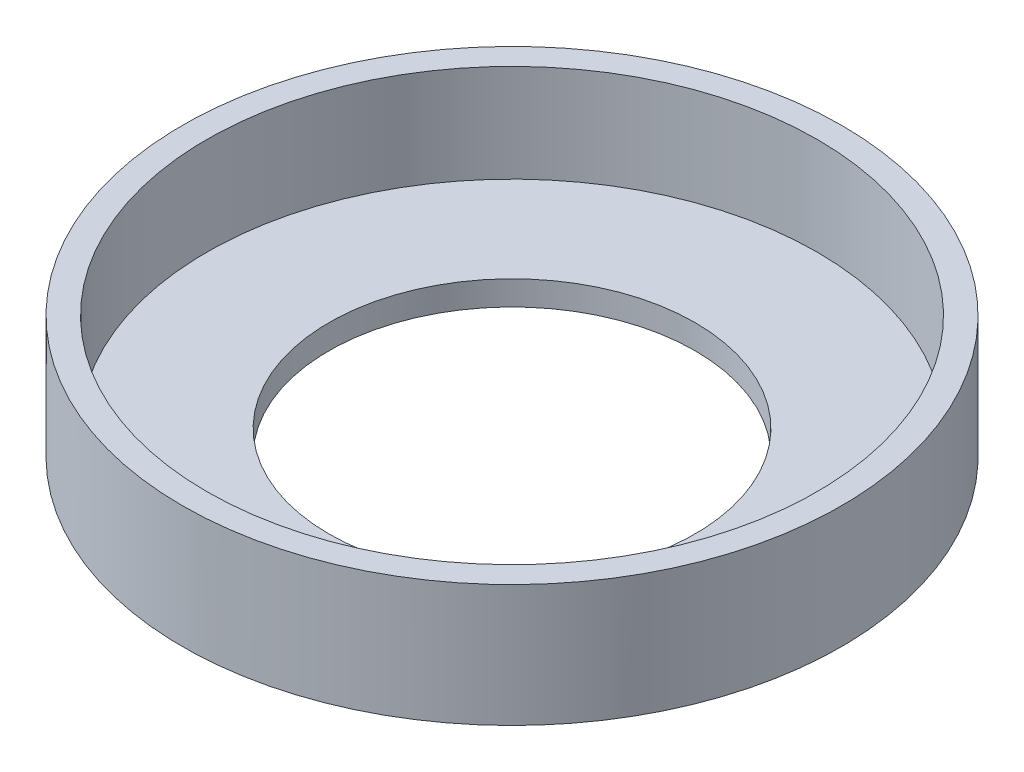
ISO-10303-21;
HEADER;
FILE_DESCRIPTION(('STEP AP214'),'2;1');
FILE_NAME('part.step','',(''),(''),'','','');
FILE_SCHEMA(('AUTOMOTIVE_DESIGN { 1 0 10303 214 1 1 1 1 }'));
ENDSEC;
DATA;
#1=APPLICATION_CONTEXT('core data for automotive mechanical design processes');
#2=APPLICATION_PROTOCOL_DEFINITION('international standard','automotive_design',2000,#1);
#3=PRODUCT_CONTEXT('',#1,'mechanical');
#4=PRODUCT('Part','Part','',(#3));
#5=PRODUCT_RELATED_PRODUCT_CATEGORY('part','',(#4));
#6=PRODUCT_DEFINITION_FORMATION('','',#4);
#7=PRODUCT_DEFINITION_CONTEXT('part definition',#1,'design');
#8=PRODUCT_DEFINITION('design','',#6,#7);
#9=PRODUCT_DEFINITION_SHAPE('','',#8);
#10=(LENGTH_UNIT() NAMED_UNIT(*) SI_UNIT(.MILLI.,.METRE.));
#11=(NAMED_UNIT(*) PLANE_ANGLE_UNIT() SI_UNIT($,.RADIAN.));
#12=(NAMED_UNIT(*) SI_UNIT($,.STERADIAN.) SOLID_ANGLE_UNIT());
#13=UNCERTAINTY_MEASURE_WITH_UNIT(LENGTH_MEASURE(1.E-05),#10,'distance_accuracy_value','');
#14=(GEOMETRIC_REPRESENTATION_CONTEXT(3) GLOBAL_UNCERTAINTY_ASSIGNED_CONTEXT((#13)) GLOBAL_UNIT_ASSIGNED_CONTEXT((#10,
#11,#12)) REPRESENTATION_CONTEXT('',''));
#15=CARTESIAN_POINT('',(0.,0.,0.));
#16=DIRECTION('',(0.,0.,1.));
#17=DIRECTION('',(1.,0.,0.));
#18=AXIS2_PLACEMENT_3D('',#15,#16,#17);
#19=CARTESIAN_POINT('',(0.,4.,0.));
#20=DIRECTION('',(0.,1.,0.));
#21=DIRECTION('',(0.,0.,1.));
#22=AXIS2_PLACEMENT_3D('',#19,#20,#21);
#23=PLANE('',#22);
#24=CARTESIAN_POINT('',(0.,4.,0.));
#25=DIRECTION('',(0.,1.,0.));
#26=DIRECTION('',(0.,0.,1.));
#27=AXIS2_PLACEMENT_3D('',#24,#25,#26);
#28=CIRCLE('',#27,13.5);
#29=CARTESIAN_POINT('',(0.,4.,13.5));
#30=VERTEX_POINT('',#29);
#31=EDGE_CURVE('E10',#30,#30,#28,.T.);
#32=ORIENTED_EDGE('',*,*,#31,.T.);
#33=EDGE_LOOP('',(#32));
#34=FACE_BOUND('',#33,.T.);
#35=CARTESIAN_POINT('',(0.,4.,0.));
#36=DIRECTION('',(0.,1.,0.));
#37=DIRECTION('',(0.,0.,1.));
#38=AXIS2_PLACEMENT_3D('',#35,#36,#37);
#39=CIRCLE('',#38,12.5);
#40=CARTESIAN_POINT('',(0.,4.,12.5));
#41=VERTEX_POINT('',#40);
#42=EDGE_CURVE('E38',#41,#41,#39,.T.);
#43=ORIENTED_EDGE('',*,*,#42,.F.);
#44=EDGE_LOOP('',(#43));
#45=FACE_BOUND('',#44,.T.);
#46=ADVANCED_FACE('F31',(#34,#45),#23,.T.);
#47=CARTESIAN_POINT('',(0.,4.,0.));
#48=DIRECTION('',(0.,-1.,0.));
#49=DIRECTION('',(0.,0.,-1.));
#50=AXIS2_PLACEMENT_3D('',#47,#48,#49);
#51=CYLINDRICAL_SURFACE('',#50,13.5);
#52=ORIENTED_EDGE('',*,*,#31,.F.);
#53=EDGE_LOOP('',(#52));
#54=FACE_BOUND('',#53,.T.);
#55=CARTESIAN_POINT('',(0.,-1.,0.));
#56=DIRECTION('',(0.,-1.,0.));
#57=DIRECTION('',(0.,0.,-1.));
#58=AXIS2_PLACEMENT_3D('',#55,#56,#57);
#59=CIRCLE('',#58,13.5);
#60=CARTESIAN_POINT('',(0.,-1.,-13.5));
#61=VERTEX_POINT('',#60);
#62=EDGE_CURVE('E47',#61,#61,#59,.T.);
#63=ORIENTED_EDGE('',*,*,#62,.F.);
#64=EDGE_LOOP('',(#63));
#65=FACE_BOUND('',#64,.T.);
#66=ADVANCED_FACE('F33',(#54,#65),#51,.T.);
#67=CARTESIAN_POINT('',(0.,4.,0.));
#68=DIRECTION('',(0.,-1.,0.));
#69=DIRECTION('',(0.,0.,-1.));
#70=AXIS2_PLACEMENT_3D('',#67,#68,#69);
#71=CYLINDRICAL_SURFACE('',#70,12.5);
#72=ORIENTED_EDGE('',*,*,#42,.T.);
#73=EDGE_LOOP('',(#72));
#74=FACE_BOUND('',#73,.T.);
#75=CARTESIAN_POINT('',(0.,0.,0.));
#76=DIRECTION('',(0.,1.,0.));
#77=DIRECTION('',(0.,0.,1.));
#78=AXIS2_PLACEMENT_3D('',#75,#76,#77);
#79=CIRCLE('',#78,12.5);
#80=CARTESIAN_POINT('',(0.,0.,12.5));
#81=VERTEX_POINT('',#80);
#82=EDGE_CURVE('E42',#81,#81,#79,.T.);
#83=ORIENTED_EDGE('',*,*,#82,.F.);
#84=EDGE_LOOP('',(#83));
#85=FACE_BOUND('',#84,.T.);
#86=ADVANCED_FACE('F71',(#74,#85),#71,.F.);
#87=CARTESIAN_POINT('',(0.,0.,0.));
#88=DIRECTION('',(0.,-1.,0.));
#89=DIRECTION('',(0.,0.,-1.));
#90=AXIS2_PLACEMENT_3D('',#87,#88,#89);
#91=PLANE('',#90);
#92=CARTESIAN_POINT('',(0.,0.,0.));
#93=DIRECTION('',(0.,-1.,0.));
#94=DIRECTION('',(0.,0.,-1.));
#95=AXIS2_PLACEMENT_3D('',#92,#93,#94);
#96=CIRCLE('',#95,7.5);
#97=CARTESIAN_POINT('',(0.,0.,-7.5));
#98=VERTEX_POINT('',#97);
#99=EDGE_CURVE('E52',#98,#98,#96,.T.);
#100=ORIENTED_EDGE('',*,*,#99,.T.);
#101=EDGE_LOOP('',(#100));
#102=FACE_BOUND('',#101,.T.);
#103=ORIENTED_EDGE('',*,*,#82,.T.);
#104=EDGE_LOOP('',(#103));
#105=FACE_BOUND('',#104,.T.);
#106=ADVANCED_FACE('F63',(#102,#105),#91,.F.);
#107=CARTESIAN_POINT('',(0.,-1.,0.));
#108=DIRECTION('',(0.,-1.,0.));
#109=DIRECTION('',(0.,0.,-1.));
#110=AXIS2_PLACEMENT_3D('',#107,#108,#109);
#111=PLANE('',#110);
#112=ORIENTED_EDGE('',*,*,#62,.T.);
#113=EDGE_LOOP('',(#112));
#114=FACE_BOUND('',#113,.T.);
#115=CARTESIAN_POINT('',(0.,-1.,0.));
#116=DIRECTION('',(0.,-1.,0.));
#117=DIRECTION('',(0.,0.,-1.));
#118=AXIS2_PLACEMENT_3D('',#115,#116,#117);
#119=CIRCLE('',#118,7.5);
#120=CARTESIAN_POINT('',(0.,-1.,-7.5));
#121=VERTEX_POINT('',#120);
#122=EDGE_CURVE('E51',#121,#121,#119,.T.);
#123=ORIENTED_EDGE('',*,*,#122,.F.);
#124=EDGE_LOOP('',(#123));
#125=FACE_BOUND('',#124,.T.);
#126=ADVANCED_FACE('F61',(#114,#125),#111,.T.);
#127=CARTESIAN_POINT('',(0.,-1.,0.));
#128=DIRECTION('',(0.,1.,0.));
#129=DIRECTION('',(0.,0.,1.));
#130=AXIS2_PLACEMENT_3D('',#127,#128,#129);
#131=CYLINDRICAL_SURFACE('',#130,7.5);
#132=ORIENTED_EDGE('',*,*,#122,.T.);
#133=EDGE_LOOP('',(#132));
#134=FACE_BOUND('',#133,.T.);
#135=ORIENTED_EDGE('',*,*,#99,.F.);
#136=EDGE_LOOP('',(#135));
#137=FACE_BOUND('',#136,.T.);
#138=ADVANCED_FACE('F58',(#134,#137),#131,.F.);
#139=CLOSED_SHELL('',(#46,#66,#86,#106,#126,#138));
#140=MANIFOLD_SOLID_BREP('B2',#139);
#141=ADVANCED_BREP_SHAPE_REPRESENTATION('',(#18,#140),#14);
#142=SHAPE_DEFINITION_REPRESENTATION(#9,#141);
ENDSEC;
END-ISO-10303-21;
